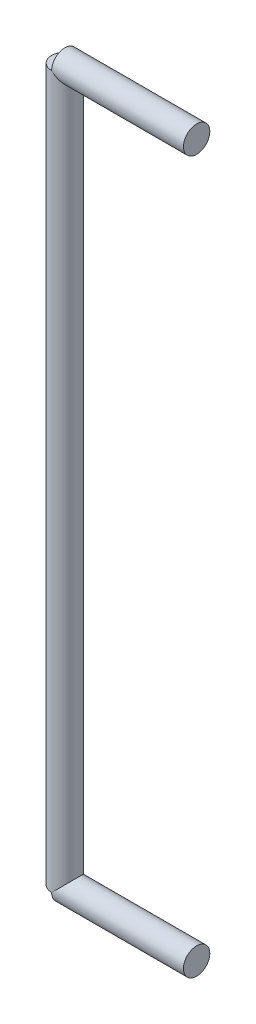
ISO-10303-21;
HEADER;
FILE_DESCRIPTION(('STEP AP214'),'2;1');
FILE_NAME('part.step','',(''),(''),'','','');
FILE_SCHEMA(('AUTOMOTIVE_DESIGN { 1 0 10303 214 1 1 1 1 }'));
ENDSEC;
DATA;
#1=APPLICATION_CONTEXT('core data for automotive mechanical design processes');
#2=APPLICATION_PROTOCOL_DEFINITION('international standard','automotive_design',2000,#1);
#3=PRODUCT_CONTEXT('',#1,'mechanical');
#4=PRODUCT('Part','Part','',(#3));
#5=PRODUCT_RELATED_PRODUCT_CATEGORY('part','',(#4));
#6=PRODUCT_DEFINITION_FORMATION('','',#4);
#7=PRODUCT_DEFINITION_CONTEXT('part definition',#1,'design');
#8=PRODUCT_DEFINITION('design','',#6,#7);
#9=PRODUCT_DEFINITION_SHAPE('','',#8);
#10=(LENGTH_UNIT() NAMED_UNIT(*) SI_UNIT(.MILLI.,.METRE.));
#11=(NAMED_UNIT(*) PLANE_ANGLE_UNIT() SI_UNIT($,.RADIAN.));
#12=(NAMED_UNIT(*) SI_UNIT($,.STERADIAN.) SOLID_ANGLE_UNIT());
#13=UNCERTAINTY_MEASURE_WITH_UNIT(LENGTH_MEASURE(1.E-05),#10,'distance_accuracy_value','');
#14=(GEOMETRIC_REPRESENTATION_CONTEXT(3) GLOBAL_UNCERTAINTY_ASSIGNED_CONTEXT((#13)) GLOBAL_UNIT_ASSIGNED_CONTEXT((#10,
#11,#12)) REPRESENTATION_CONTEXT('',''));
#15=CARTESIAN_POINT('',(0.,0.,0.));
#16=DIRECTION('',(0.,0.,1.));
#17=DIRECTION('',(1.,0.,0.));
#18=AXIS2_PLACEMENT_3D('',#15,#16,#17);
#19=CARTESIAN_POINT('',(5.,0.,0.));
#20=DIRECTION('',(-1.,0.,0.));
#21=DIRECTION('',(0.,0.,1.));
#22=AXIS2_PLACEMENT_3D('',#19,#20,#21);
#23=CYLINDRICAL_SURFACE('',#22,0.5);
#24=CARTESIAN_POINT('',(5.,0.,0.));
#25=DIRECTION('',(1.,0.,0.));
#26=DIRECTION('',(0.,0.,-1.));
#27=AXIS2_PLACEMENT_3D('',#24,#25,#26);
#28=CIRCLE('',#27,0.5);
#29=CARTESIAN_POINT('',(5.,0.,-0.5));
#30=VERTEX_POINT('',#29);
#31=EDGE_CURVE('E77',#30,#30,#28,.T.);
#32=ORIENTED_EDGE('',*,*,#31,.F.);
#33=EDGE_LOOP('',(#32));
#34=FACE_BOUND('',#33,.T.);
#35=CARTESIAN_POINT('',(0.,0.,0.));
#36=DIRECTION('',(1.,0.,0.));
#37=DIRECTION('',(0.,0.,-1.));
#38=AXIS2_PLACEMENT_3D('',#35,#36,#37);
#39=CIRCLE('',#38,0.5);
#40=CARTESIAN_POINT('',(0.,0.,0.5));
#41=VERTEX_POINT('',#40);
#42=CARTESIAN_POINT('',(0.,0.,-0.5));
#43=VERTEX_POINT('',#42);
#44=EDGE_CURVE('E78',#41,#43,#39,.T.);
#45=ORIENTED_EDGE('',*,*,#44,.T.);
#46=CARTESIAN_POINT('',(0.,0.,0.));
#47=DIRECTION('',(0.707106781186547,-0.707106781186547,0.));
#48=DIRECTION('',(-0.707106781186547,-0.707106781186547,0.));
#49=AXIS2_PLACEMENT_3D('',#46,#47,#48);
#50=ELLIPSE('',#49,0.707106781186547,0.5);
#51=EDGE_CURVE('E75',#43,#41,#50,.T.);
#52=ORIENTED_EDGE('',*,*,#51,.T.);
#53=EDGE_LOOP('',(#45,#52));
#54=FACE_BOUND('',#53,.T.);
#55=ADVANCED_FACE('F39',(#34,#54),#23,.T.);
#56=CARTESIAN_POINT('',(0.,0.,0.));
#57=DIRECTION('',(1.,0.,0.));
#58=DIRECTION('',(0.,0.,-1.));
#59=AXIS2_PLACEMENT_3D('',#56,#57,#58);
#60=PLANE('',#59);
#61=ORIENTED_EDGE('',*,*,#44,.F.);
#62=DIRECTION('',(0.,0.,-1.));
#63=VECTOR('',#62,1.);
#64=CARTESIAN_POINT('',(0.,0.,0.));
#65=LINE('',#64,#63);
#66=EDGE_CURVE('E50',#41,#43,#65,.T.);
#67=ORIENTED_EDGE('',*,*,#66,.T.);
#68=EDGE_LOOP('',(#61,#67));
#69=FACE_BOUND('',#68,.T.);
#70=ADVANCED_FACE('F76',(#69),#60,.F.);
#71=CARTESIAN_POINT('',(5.,0.,0.));
#72=DIRECTION('',(1.,0.,0.));
#73=DIRECTION('',(0.,0.,-1.));
#74=AXIS2_PLACEMENT_3D('',#71,#72,#73);
#75=PLANE('',#74);
#76=ORIENTED_EDGE('',*,*,#31,.T.);
#77=EDGE_LOOP('',(#76));
#78=FACE_BOUND('',#77,.T.);
#79=ADVANCED_FACE('F116',(#78),#75,.T.);
#80=CARTESIAN_POINT('',(0.,27.,0.));
#81=DIRECTION('',(0.,-1.,0.));
#82=DIRECTION('',(0.,0.,-1.));
#83=AXIS2_PLACEMENT_3D('',#80,#81,#82);
#84=CYLINDRICAL_SURFACE('',#83,0.5);
#85=CARTESIAN_POINT('',(0.,27.,0.));
#86=DIRECTION('',(-0.707106781186547,-0.707106781186547,0.));
#87=DIRECTION('',(0.707106781186547,-0.707106781186547,0.));
#88=AXIS2_PLACEMENT_3D('',#85,#86,#87);
#89=ELLIPSE('',#88,0.707106781186548,0.5);
#90=CARTESIAN_POINT('',(0.,27.,0.5));
#91=VERTEX_POINT('',#90);
#92=CARTESIAN_POINT('',(0.,27.,-0.5));
#93=VERTEX_POINT('',#92);
#94=EDGE_CURVE('E69',#91,#93,#89,.F.);
#95=ORIENTED_EDGE('',*,*,#94,.F.);
#96=CARTESIAN_POINT('',(0.,27.,0.));
#97=DIRECTION('',(0.,1.,0.));
#98=DIRECTION('',(0.,0.,1.));
#99=AXIS2_PLACEMENT_3D('',#96,#97,#98);
#100=CIRCLE('',#99,0.5);
#101=EDGE_CURVE('E67',#93,#91,#100,.T.);
#102=ORIENTED_EDGE('',*,*,#101,.F.);
#103=EDGE_LOOP('',(#95,#102));
#104=FACE_BOUND('',#103,.T.);
#105=ORIENTED_EDGE('',*,*,#51,.F.);
#106=CARTESIAN_POINT('',(0.,0.,0.));
#107=DIRECTION('',(0.,1.,0.));
#108=DIRECTION('',(0.,0.,1.));
#109=AXIS2_PLACEMENT_3D('',#106,#107,#108);
#110=CIRCLE('',#109,0.5);
#111=EDGE_CURVE('E63',#43,#41,#110,.T.);
#112=ORIENTED_EDGE('',*,*,#111,.T.);
#113=EDGE_LOOP('',(#105,#112));
#114=FACE_BOUND('',#113,.T.);
#115=ADVANCED_FACE('F41',(#104,#114),#84,.T.);
#116=CARTESIAN_POINT('',(0.,27.,0.));
#117=DIRECTION('',(0.,1.,0.));
#118=DIRECTION('',(0.,0.,1.));
#119=AXIS2_PLACEMENT_3D('',#116,#117,#118);
#120=PLANE('',#119);
#121=ORIENTED_EDGE('',*,*,#101,.T.);
#122=DIRECTION('',(0.,0.,-1.));
#123=VECTOR('',#122,1.);
#124=CARTESIAN_POINT('',(0.,27.,0.));
#125=LINE('',#124,#123);
#126=EDGE_CURVE('E11',#91,#93,#125,.T.);
#127=ORIENTED_EDGE('',*,*,#126,.T.);
#128=EDGE_LOOP('',(#121,#127));
#129=FACE_BOUND('',#128,.T.);
#130=ADVANCED_FACE('F91',(#129),#120,.T.);
#131=CARTESIAN_POINT('',(0.,0.,0.));
#132=DIRECTION('',(0.,1.,0.));
#133=DIRECTION('',(0.,0.,1.));
#134=AXIS2_PLACEMENT_3D('',#131,#132,#133);
#135=PLANE('',#134);
#136=ORIENTED_EDGE('',*,*,#66,.F.);
#137=ORIENTED_EDGE('',*,*,#111,.F.);
#138=EDGE_LOOP('',(#136,#137));
#139=FACE_BOUND('',#138,.T.);
#140=ADVANCED_FACE('F66',(#139),#135,.F.);
#141=CARTESIAN_POINT('',(5.,27.,0.));
#142=DIRECTION('',(-1.,0.,0.));
#143=DIRECTION('',(0.,0.,1.));
#144=AXIS2_PLACEMENT_3D('',#141,#142,#143);
#145=CYLINDRICAL_SURFACE('',#144,0.5);
#146=CARTESIAN_POINT('',(5.,27.,0.));
#147=DIRECTION('',(1.,0.,0.));
#148=DIRECTION('',(0.,0.,-1.));
#149=AXIS2_PLACEMENT_3D('',#146,#147,#148);
#150=CIRCLE('',#149,0.5);
#151=CARTESIAN_POINT('',(5.,27.,-0.5));
#152=VERTEX_POINT('',#151);
#153=EDGE_CURVE('E81',#152,#152,#150,.T.);
#154=ORIENTED_EDGE('',*,*,#153,.F.);
#155=EDGE_LOOP('',(#154));
#156=FACE_BOUND('',#155,.T.);
#157=CARTESIAN_POINT('',(0.,27.,0.));
#158=DIRECTION('',(1.,0.,0.));
#159=DIRECTION('',(0.,0.,-1.));
#160=AXIS2_PLACEMENT_3D('',#157,#158,#159);
#161=CIRCLE('',#160,0.5);
#162=EDGE_CURVE('E52',#93,#91,#161,.T.);
#163=ORIENTED_EDGE('',*,*,#162,.T.);
#164=ORIENTED_EDGE('',*,*,#94,.T.);
#165=EDGE_LOOP('',(#163,#164));
#166=FACE_BOUND('',#165,.T.);
#167=ADVANCED_FACE('F100',(#156,#166),#145,.T.);
#168=CARTESIAN_POINT('',(5.,27.,0.));
#169=DIRECTION('',(1.,0.,0.));
#170=DIRECTION('',(0.,0.,-1.));
#171=AXIS2_PLACEMENT_3D('',#168,#169,#170);
#172=PLANE('',#171);
#173=ORIENTED_EDGE('',*,*,#153,.T.);
#174=EDGE_LOOP('',(#173));
#175=FACE_BOUND('',#174,.T.);
#176=ADVANCED_FACE('F97',(#175),#172,.T.);
#177=CARTESIAN_POINT('',(0.,27.,0.));
#178=DIRECTION('',(1.,0.,0.));
#179=DIRECTION('',(0.,0.,-1.));
#180=AXIS2_PLACEMENT_3D('',#177,#178,#179);
#181=PLANE('',#180);
#182=ORIENTED_EDGE('',*,*,#126,.F.);
#183=ORIENTED_EDGE('',*,*,#162,.F.);
#184=EDGE_LOOP('',(#182,#183));
#185=FACE_BOUND('',#184,.T.);
#186=ADVANCED_FACE('F106',(#185),#181,.F.);
#187=CLOSED_SHELL('',(#55,#70,#79,#115,#130,#140,#167,#176,#186));
#188=MANIFOLD_SOLID_BREP('B2',#187);
#189=ADVANCED_BREP_SHAPE_REPRESENTATION('',(#18,#188),#14);
#190=SHAPE_DEFINITION_REPRESENTATION(#9,#189);
ENDSEC;
END-ISO-10303-21;
